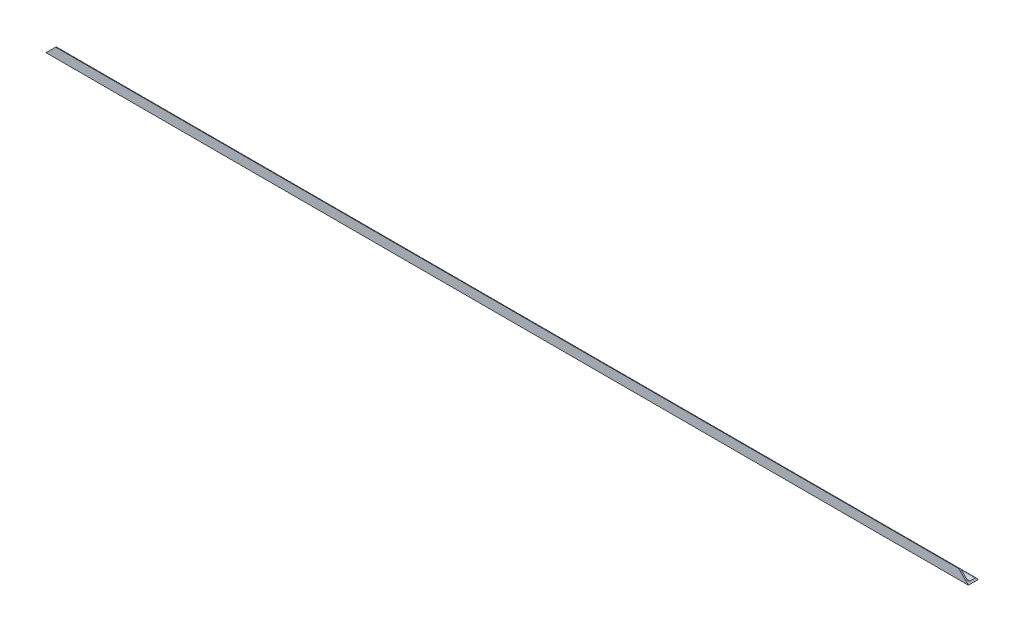
ISO-10303-21;
HEADER;
FILE_DESCRIPTION(('STEP AP214'),'2;1');
FILE_NAME('part.step','',(''),(''),'','','');
FILE_SCHEMA(('AUTOMOTIVE_DESIGN { 1 0 10303 214 1 1 1 1 }'));
ENDSEC;
DATA;
#1=APPLICATION_CONTEXT('core data for automotive mechanical design processes');
#2=APPLICATION_PROTOCOL_DEFINITION('international standard','automotive_design',2000,#1);
#3=PRODUCT_CONTEXT('',#1,'mechanical');
#4=PRODUCT('Part','Part','',(#3));
#5=PRODUCT_RELATED_PRODUCT_CATEGORY('part','',(#4));
#6=PRODUCT_DEFINITION_FORMATION('','',#4);
#7=PRODUCT_DEFINITION_CONTEXT('part definition',#1,'design');
#8=PRODUCT_DEFINITION('design','',#6,#7);
#9=PRODUCT_DEFINITION_SHAPE('','',#8);
#10=(LENGTH_UNIT() NAMED_UNIT(*) SI_UNIT(.MILLI.,.METRE.));
#11=(NAMED_UNIT(*) PLANE_ANGLE_UNIT() SI_UNIT($,.RADIAN.));
#12=(NAMED_UNIT(*) SI_UNIT($,.STERADIAN.) SOLID_ANGLE_UNIT());
#13=UNCERTAINTY_MEASURE_WITH_UNIT(LENGTH_MEASURE(1.E-05),#10,'distance_accuracy_value','');
#14=(GEOMETRIC_REPRESENTATION_CONTEXT(3) GLOBAL_UNCERTAINTY_ASSIGNED_CONTEXT((#13)) GLOBAL_UNIT_ASSIGNED_CONTEXT((#10,
#11,#12)) REPRESENTATION_CONTEXT('',''));
#15=CARTESIAN_POINT('',(0.,0.,0.));
#16=DIRECTION('',(0.,0.,1.));
#17=DIRECTION('',(1.,0.,0.));
#18=AXIS2_PLACEMENT_3D('',#15,#16,#17);
#19=CARTESIAN_POINT('',(1920.,0.,-20.));
#20=DIRECTION('',(0.,1.,0.));
#21=DIRECTION('',(0.,0.,1.));
#22=AXIS2_PLACEMENT_3D('',#19,#20,#21);
#23=PLANE('',#22);
#24=DIRECTION('',(0.,0.,-1.));
#25=VECTOR('',#24,1.);
#26=CARTESIAN_POINT('',(0.,0.,-20.));
#27=LINE('',#26,#25);
#28=CARTESIAN_POINT('',(0.,0.,0.));
#29=VERTEX_POINT('',#28);
#30=CARTESIAN_POINT('',(0.,0.,-20.));
#31=VERTEX_POINT('',#30);
#32=EDGE_CURVE('E119',#29,#31,#27,.T.);
#33=ORIENTED_EDGE('',*,*,#32,.T.);
#34=DIRECTION('',(-1.,0.,0.));
#35=VECTOR('',#34,1.);
#36=CARTESIAN_POINT('',(1920.,0.,-20.));
#37=LINE('',#36,#35);
#38=CARTESIAN_POINT('',(1920.,0.,-20.));
#39=VERTEX_POINT('',#38);
#40=EDGE_CURVE('E13',#39,#31,#37,.T.);
#41=ORIENTED_EDGE('',*,*,#40,.F.);
#42=DIRECTION('',(0.,0.,-1.));
#43=VECTOR('',#42,1.);
#44=CARTESIAN_POINT('',(1920.,0.,-20.));
#45=LINE('',#44,#43);
#46=CARTESIAN_POINT('',(1920.,0.,0.));
#47=VERTEX_POINT('',#46);
#48=EDGE_CURVE('E130',#47,#39,#45,.T.);
#49=ORIENTED_EDGE('',*,*,#48,.F.);
#50=DIRECTION('',(-1.,0.,0.));
#51=VECTOR('',#50,1.);
#52=CARTESIAN_POINT('',(1920.,0.,0.));
#53=LINE('',#52,#51);
#54=EDGE_CURVE('E136',#47,#29,#53,.T.);
#55=ORIENTED_EDGE('',*,*,#54,.T.);
#56=EDGE_LOOP('',(#33,#41,#49,#55));
#57=FACE_BOUND('',#56,.T.);
#58=ADVANCED_FACE('F65',(#57),#23,.F.);
#59=CARTESIAN_POINT('',(1920.,0.,-17.));
#60=DIRECTION('',(-1.,0.,0.));
#61=DIRECTION('',(0.,0.,1.));
#62=AXIS2_PLACEMENT_3D('',#59,#60,#61);
#63=CYLINDRICAL_SURFACE('',#62,3.);
#64=ORIENTED_EDGE('',*,*,#40,.T.);
#65=CARTESIAN_POINT('',(0.,0.,-17.));
#66=DIRECTION('',(0.707106781186548,-0.707106781186548,0.));
#67=DIRECTION('',(-0.707106781186548,-0.707106781186548,0.));
#68=AXIS2_PLACEMENT_3D('',#65,#66,#67);
#69=ELLIPSE('',#68,4.24264068711928,3.);
#70=CARTESIAN_POINT('',(3.00000000000011,3.,-17.));
#71=VERTEX_POINT('',#70);
#72=EDGE_CURVE('E125',#31,#71,#69,.T.);
#73=ORIENTED_EDGE('',*,*,#72,.T.);
#74=DIRECTION('',(-1.,0.,0.));
#75=VECTOR('',#74,1.);
#76=CARTESIAN_POINT('',(1920.,3.,-17.));
#77=LINE('',#76,#75);
#78=CARTESIAN_POINT('',(1917.,3.,-17.));
#79=VERTEX_POINT('',#78);
#80=EDGE_CURVE('E74',#79,#71,#77,.T.);
#81=ORIENTED_EDGE('',*,*,#80,.F.);
#82=CARTESIAN_POINT('',(1920.,0.,-17.));
#83=DIRECTION('',(-0.707106781186553,-0.707106781186542,0.));
#84=DIRECTION('',(-0.707106781186542,0.707106781186553,0.));
#85=AXIS2_PLACEMENT_3D('',#82,#83,#84);
#86=ELLIPSE('',#85,4.24264068711925,3.);
#87=EDGE_CURVE('E131',#79,#39,#86,.T.);
#88=ORIENTED_EDGE('',*,*,#87,.T.);
#89=EDGE_LOOP('',(#64,#73,#81,#88));
#90=FACE_BOUND('',#89,.T.);
#91=ADVANCED_FACE('F173',(#90),#63,.T.);
#92=CARTESIAN_POINT('',(1920.,3.,-6.5));
#93=DIRECTION('',(0.,-1.,0.));
#94=DIRECTION('',(0.,0.,-1.));
#95=AXIS2_PLACEMENT_3D('',#92,#93,#94);
#96=PLANE('',#95);
#97=ORIENTED_EDGE('',*,*,#80,.T.);
#98=DIRECTION('',(0.,0.,1.));
#99=VECTOR('',#98,1.);
#100=CARTESIAN_POINT('',(3.00000000000011,3.,-6.5));
#101=LINE('',#100,#99);
#102=CARTESIAN_POINT('',(3.00000000000011,3.,-6.5));
#103=VERTEX_POINT('',#102);
#104=EDGE_CURVE('E169',#71,#103,#101,.T.);
#105=ORIENTED_EDGE('',*,*,#104,.T.);
#106=DIRECTION('',(-1.,0.,0.));
#107=VECTOR('',#106,1.);
#108=CARTESIAN_POINT('',(1920.,3.,-6.5));
#109=LINE('',#108,#107);
#110=CARTESIAN_POINT('',(1917.,3.,-6.5));
#111=VERTEX_POINT('',#110);
#112=EDGE_CURVE('E158',#111,#103,#109,.T.);
#113=ORIENTED_EDGE('',*,*,#112,.F.);
#114=DIRECTION('',(0.,0.,-1.));
#115=VECTOR('',#114,1.);
#116=CARTESIAN_POINT('',(1917.,3.,-6.5));
#117=LINE('',#116,#115);
#118=EDGE_CURVE('E170',#111,#79,#117,.T.);
#119=ORIENTED_EDGE('',*,*,#118,.T.);
#120=EDGE_LOOP('',(#97,#105,#113,#119));
#121=FACE_BOUND('',#120,.T.);
#122=ADVANCED_FACE('F167',(#121),#96,.F.);
#123=CARTESIAN_POINT('',(1920.,6.5,-6.5));
#124=DIRECTION('',(-1.,0.,0.));
#125=DIRECTION('',(0.,0.,1.));
#126=AXIS2_PLACEMENT_3D('',#123,#124,#125);
#127=CYLINDRICAL_SURFACE('',#126,3.5);
#128=ORIENTED_EDGE('',*,*,#112,.T.);
#129=CARTESIAN_POINT('',(6.49999999999995,6.5,-6.5));
#130=DIRECTION('',(0.707106781186548,-0.707106781186548,0.));
#131=DIRECTION('',(-0.707106781186548,-0.707106781186548,0.));
#132=AXIS2_PLACEMENT_3D('',#129,#130,#131);
#133=ELLIPSE('',#132,4.94974746830583,3.5);
#134=CARTESIAN_POINT('',(6.50000000000006,6.50000000000017,-3.));
#135=VERTEX_POINT('',#134);
#136=EDGE_CURVE('E182',#103,#135,#133,.F.);
#137=ORIENTED_EDGE('',*,*,#136,.T.);
#138=DIRECTION('',(-1.,0.,0.));
#139=VECTOR('',#138,1.);
#140=CARTESIAN_POINT('',(1920.,6.5,-3.));
#141=LINE('',#140,#139);
#142=CARTESIAN_POINT('',(1913.5,6.5,-3.));
#143=VERTEX_POINT('',#142);
#144=EDGE_CURVE('E154',#143,#135,#141,.T.);
#145=ORIENTED_EDGE('',*,*,#144,.F.);
#146=CARTESIAN_POINT('',(1913.5,6.5,-6.5));
#147=DIRECTION('',(-0.707106781186553,-0.707106781186542,0.));
#148=DIRECTION('',(-0.707106781186542,0.707106781186553,0.));
#149=AXIS2_PLACEMENT_3D('',#146,#147,#148);
#150=ELLIPSE('',#149,4.94974746830579,3.5);
#151=EDGE_CURVE('E189',#143,#111,#150,.F.);
#152=ORIENTED_EDGE('',*,*,#151,.T.);
#153=EDGE_LOOP('',(#128,#137,#145,#152));
#154=FACE_BOUND('',#153,.T.);
#155=ADVANCED_FACE('F198',(#154),#127,.F.);
#156=CARTESIAN_POINT('',(1920.,17.,-3.));
#157=DIRECTION('',(0.,0.,1.));
#158=DIRECTION('',(0.,-1.,0.));
#159=AXIS2_PLACEMENT_3D('',#156,#157,#158);
#160=PLANE('',#159);
#161=ORIENTED_EDGE('',*,*,#144,.T.);
#162=DIRECTION('',(0.707106781186548,0.707106781186548,0.));
#163=VECTOR('',#162,1.);
#164=CARTESIAN_POINT('',(968.5,968.5,-3.00000000000004));
#165=LINE('',#164,#163);
#166=CARTESIAN_POINT('',(16.9999999999999,17.,-3.));
#167=VERTEX_POINT('',#166);
#168=EDGE_CURVE('E205',#135,#167,#165,.T.);
#169=ORIENTED_EDGE('',*,*,#168,.T.);
#170=DIRECTION('',(-1.,0.,0.));
#171=VECTOR('',#170,1.);
#172=CARTESIAN_POINT('',(1920.,17.,-3.));
#173=LINE('',#172,#171);
#174=CARTESIAN_POINT('',(1903.,17.,-3.));
#175=VERTEX_POINT('',#174);
#176=EDGE_CURVE('E147',#175,#167,#173,.T.);
#177=ORIENTED_EDGE('',*,*,#176,.F.);
#178=DIRECTION('',(0.707106781186542,-0.707106781186553,0.));
#179=VECTOR('',#178,1.);
#180=CARTESIAN_POINT('',(1911.5,8.50000000000014,-3.));
#181=LINE('',#180,#179);
#182=EDGE_CURVE('E180',#175,#143,#181,.T.);
#183=ORIENTED_EDGE('',*,*,#182,.T.);
#184=EDGE_LOOP('',(#161,#169,#177,#183));
#185=FACE_BOUND('',#184,.T.);
#186=ADVANCED_FACE('F203',(#185),#160,.F.);
#187=CARTESIAN_POINT('',(1920.,17.,0.));
#188=DIRECTION('',(-1.,0.,0.));
#189=DIRECTION('',(0.,0.,1.));
#190=AXIS2_PLACEMENT_3D('',#187,#188,#189);
#191=CYLINDRICAL_SURFACE('',#190,3.);
#192=ORIENTED_EDGE('',*,*,#176,.T.);
#193=CARTESIAN_POINT('',(16.9999999999999,17.,0.));
#194=DIRECTION('',(0.707106781186548,-0.707106781186548,0.));
#195=DIRECTION('',(-0.707106781186548,-0.707106781186548,0.));
#196=AXIS2_PLACEMENT_3D('',#193,#194,#195);
#197=ELLIPSE('',#196,4.24264068711928,3.);
#198=CARTESIAN_POINT('',(20.,20.,0.));
#199=VERTEX_POINT('',#198);
#200=EDGE_CURVE('E141',#167,#199,#197,.T.);
#201=ORIENTED_EDGE('',*,*,#200,.T.);
#202=DIRECTION('',(-1.,0.,0.));
#203=VECTOR('',#202,1.);
#204=CARTESIAN_POINT('',(1920.,20.,0.));
#205=LINE('',#204,#203);
#206=CARTESIAN_POINT('',(1900.,20.0000000000003,0.));
#207=VERTEX_POINT('',#206);
#208=EDGE_CURVE('E139',#207,#199,#205,.T.);
#209=ORIENTED_EDGE('',*,*,#208,.F.);
#210=CARTESIAN_POINT('',(1903.,17.,0.));
#211=DIRECTION('',(-0.707106781186553,-0.707106781186542,0.));
#212=DIRECTION('',(-0.707106781186542,0.707106781186553,0.));
#213=AXIS2_PLACEMENT_3D('',#210,#211,#212);
#214=ELLIPSE('',#213,4.24264068711925,3.);
#215=EDGE_CURVE('E175',#207,#175,#214,.T.);
#216=ORIENTED_EDGE('',*,*,#215,.T.);
#217=EDGE_LOOP('',(#192,#201,#209,#216));
#218=FACE_BOUND('',#217,.T.);
#219=ADVANCED_FACE('F207',(#218),#191,.T.);
#220=CARTESIAN_POINT('',(1920.,20.,0.));
#221=DIRECTION('',(0.,0.,-1.));
#222=DIRECTION('',(-1.,0.,0.));
#223=AXIS2_PLACEMENT_3D('',#220,#221,#222);
#224=PLANE('',#223);
#225=ORIENTED_EDGE('',*,*,#208,.T.);
#226=DIRECTION('',(0.707106781186548,0.707106781186548,0.));
#227=VECTOR('',#226,1.);
#228=CARTESIAN_POINT('',(20.,20.,0.));
#229=LINE('',#228,#227);
#230=EDGE_CURVE('E122',#29,#199,#229,.T.);
#231=ORIENTED_EDGE('',*,*,#230,.F.);
#232=ORIENTED_EDGE('',*,*,#54,.F.);
#233=DIRECTION('',(0.707106781186542,-0.707106781186553,0.));
#234=VECTOR('',#233,1.);
#235=CARTESIAN_POINT('',(1900.,20.0000000000003,0.));
#236=LINE('',#235,#234);
#237=EDGE_CURVE('E80',#207,#47,#236,.T.);
#238=ORIENTED_EDGE('',*,*,#237,.F.);
#239=EDGE_LOOP('',(#225,#231,#232,#238));
#240=FACE_BOUND('',#239,.T.);
#241=ADVANCED_FACE('F135',(#240),#224,.F.);
#242=CARTESIAN_POINT('',(20.,20.,-20.));
#243=DIRECTION('',(0.707106781186548,-0.707106781186548,0.));
#244=DIRECTION('',(0.707106781186548,0.707106781186548,0.));
#245=AXIS2_PLACEMENT_3D('',#242,#243,#244);
#246=PLANE('',#245);
#247=ORIENTED_EDGE('',*,*,#32,.F.);
#248=ORIENTED_EDGE('',*,*,#230,.T.);
#249=ORIENTED_EDGE('',*,*,#200,.F.);
#250=ORIENTED_EDGE('',*,*,#168,.F.);
#251=ORIENTED_EDGE('',*,*,#136,.F.);
#252=ORIENTED_EDGE('',*,*,#104,.F.);
#253=ORIENTED_EDGE('',*,*,#72,.F.);
#254=EDGE_LOOP('',(#247,#248,#249,#250,#251,#252,#253));
#255=FACE_BOUND('',#254,.T.);
#256=ADVANCED_FACE('F121',(#255),#246,.F.);
#257=CARTESIAN_POINT('',(1900.,20.0000000000003,-20.));
#258=DIRECTION('',(-0.707106781186553,-0.707106781186542,0.));
#259=DIRECTION('',(0.707106781186542,-0.707106781186553,0.));
#260=AXIS2_PLACEMENT_3D('',#257,#258,#259);
#261=PLANE('',#260);
#262=ORIENTED_EDGE('',*,*,#118,.F.);
#263=ORIENTED_EDGE('',*,*,#151,.F.);
#264=ORIENTED_EDGE('',*,*,#182,.F.);
#265=ORIENTED_EDGE('',*,*,#215,.F.);
#266=ORIENTED_EDGE('',*,*,#237,.T.);
#267=ORIENTED_EDGE('',*,*,#48,.T.);
#268=ORIENTED_EDGE('',*,*,#87,.F.);
#269=EDGE_LOOP('',(#262,#263,#264,#265,#266,#267,#268));
#270=FACE_BOUND('',#269,.T.);
#271=ADVANCED_FACE('F200',(#270),#261,.F.);
#272=CLOSED_SHELL('',(#58,#91,#122,#155,#186,#219,#241,#256,#271));
#273=MANIFOLD_SOLID_BREP('B2',#272);
#274=ADVANCED_BREP_SHAPE_REPRESENTATION('',(#18,#273),#14);
#275=SHAPE_DEFINITION_REPRESENTATION(#9,#274);
ENDSEC;
END-ISO-10303-21;
